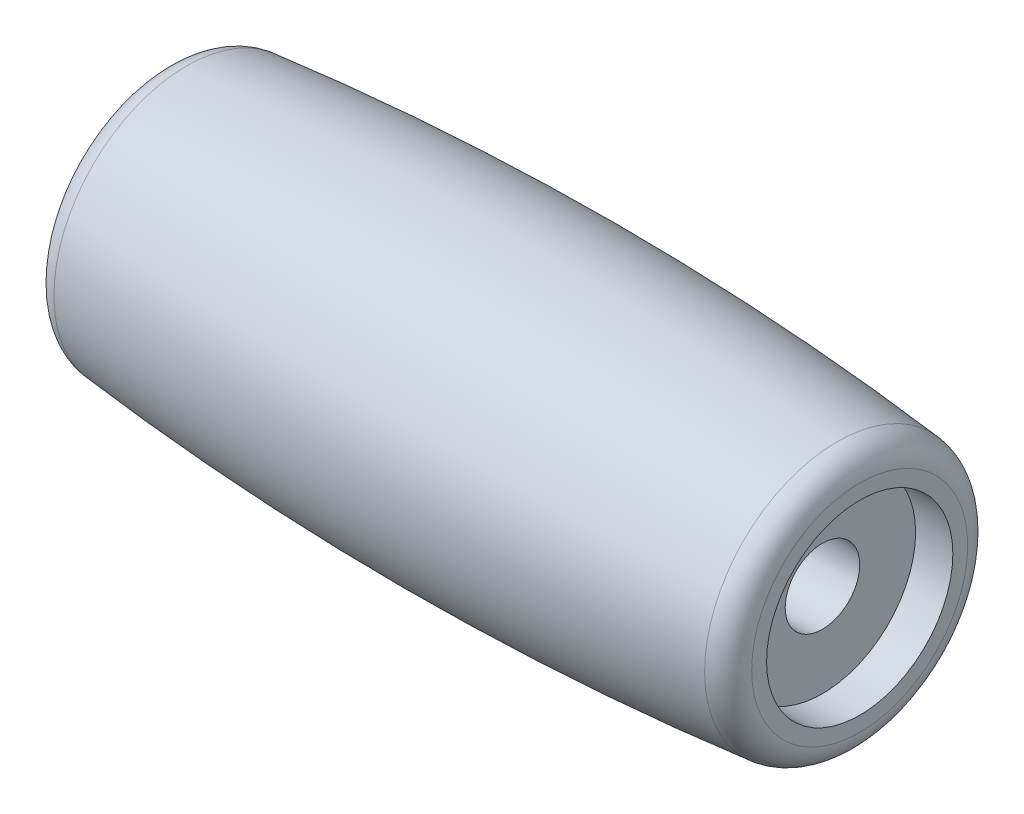
ISO-10303-21;
HEADER;
FILE_DESCRIPTION(('STEP AP214'),'2;1');
FILE_NAME('part.step','',(''),(''),'','','');
FILE_SCHEMA(('AUTOMOTIVE_DESIGN { 1 0 10303 214 1 1 1 1 }'));
ENDSEC;
DATA;
#1=APPLICATION_CONTEXT('core data for automotive mechanical design processes');
#2=APPLICATION_PROTOCOL_DEFINITION('international standard','automotive_design',2000,#1);
#3=PRODUCT_CONTEXT('',#1,'mechanical');
#4=PRODUCT('Part','Part','',(#3));
#5=PRODUCT_RELATED_PRODUCT_CATEGORY('part','',(#4));
#6=PRODUCT_DEFINITION_FORMATION('','',#4);
#7=PRODUCT_DEFINITION_CONTEXT('part definition',#1,'design');
#8=PRODUCT_DEFINITION('design','',#6,#7);
#9=PRODUCT_DEFINITION_SHAPE('','',#8);
#10=(LENGTH_UNIT() NAMED_UNIT(*) SI_UNIT(.MILLI.,.METRE.));
#11=(NAMED_UNIT(*) PLANE_ANGLE_UNIT() SI_UNIT($,.RADIAN.));
#12=(NAMED_UNIT(*) SI_UNIT($,.STERADIAN.) SOLID_ANGLE_UNIT());
#13=UNCERTAINTY_MEASURE_WITH_UNIT(LENGTH_MEASURE(1.E-05),#10,'distance_accuracy_value','');
#14=(GEOMETRIC_REPRESENTATION_CONTEXT(3) GLOBAL_UNCERTAINTY_ASSIGNED_CONTEXT((#13)) GLOBAL_UNIT_ASSIGNED_CONTEXT((#10,
#11,#12)) REPRESENTATION_CONTEXT('',''));
#15=CARTESIAN_POINT('',(0.,0.,0.));
#16=DIRECTION('',(0.,0.,1.));
#17=DIRECTION('',(1.,0.,0.));
#18=AXIS2_PLACEMENT_3D('',#15,#16,#17);
#19=CARTESIAN_POINT('',(12.5,1.5,0.));
#20=DIRECTION('',(-1.,0.,0.));
#21=DIRECTION('',(0.,0.,1.));
#22=AXIS2_PLACEMENT_3D('',#19,#20,#21);
#23=PLANE('',#22);
#24=CARTESIAN_POINT('',(12.5,0.,0.));
#25=DIRECTION('',(-1.,0.,0.));
#26=DIRECTION('',(0.,0.,1.));
#27=AXIS2_PLACEMENT_3D('',#24,#25,#26);
#28=CIRCLE('',#27,3.75);
#29=CARTESIAN_POINT('',(12.5,0.,3.75));
#30=VERTEX_POINT('',#29);
#31=EDGE_CURVE('E10',#30,#30,#28,.T.);
#32=ORIENTED_EDGE('',*,*,#31,.F.);
#33=EDGE_LOOP('',(#32));
#34=FACE_BOUND('',#33,.T.);
#35=CARTESIAN_POINT('',(12.5,0.,0.));
#36=DIRECTION('',(-1.,0.,0.));
#37=DIRECTION('',(0.,0.,1.));
#38=AXIS2_PLACEMENT_3D('',#35,#36,#37);
#39=CIRCLE('',#38,1.5);
#40=CARTESIAN_POINT('',(12.5,0.,1.5));
#41=VERTEX_POINT('',#40);
#42=EDGE_CURVE('E68',#41,#41,#39,.T.);
#43=ORIENTED_EDGE('',*,*,#42,.T.);
#44=EDGE_LOOP('',(#43));
#45=FACE_BOUND('',#44,.T.);
#46=ADVANCED_FACE('F34',(#34,#45),#23,.F.);
#47=CARTESIAN_POINT('',(0.,0.,0.));
#48=DIRECTION('',(-1.,0.,0.));
#49=DIRECTION('',(0.,0.,1.));
#50=AXIS2_PLACEMENT_3D('',#47,#48,#49);
#51=CYLINDRICAL_SURFACE('',#50,3.75);
#52=CARTESIAN_POINT('',(14.,0.,0.));
#53=DIRECTION('',(-1.,0.,0.));
#54=DIRECTION('',(0.,0.,1.));
#55=AXIS2_PLACEMENT_3D('',#52,#53,#54);
#56=CIRCLE('',#55,3.75);
#57=CARTESIAN_POINT('',(14.,0.,3.75));
#58=VERTEX_POINT('',#57);
#59=EDGE_CURVE('E40',#58,#58,#56,.T.);
#60=ORIENTED_EDGE('',*,*,#59,.F.);
#61=EDGE_LOOP('',(#60));
#62=FACE_BOUND('',#61,.T.);
#63=ORIENTED_EDGE('',*,*,#31,.T.);
#64=EDGE_LOOP('',(#63));
#65=FACE_BOUND('',#64,.T.);
#66=ADVANCED_FACE('F117',(#62,#65),#51,.F.);
#67=CARTESIAN_POINT('',(14.,3.75,0.));
#68=DIRECTION('',(-1.,0.,0.));
#69=DIRECTION('',(0.,0.,1.));
#70=AXIS2_PLACEMENT_3D('',#67,#68,#69);
#71=PLANE('',#70);
#72=CARTESIAN_POINT('',(14.,0.,0.));
#73=DIRECTION('',(-1.,0.,0.));
#74=DIRECTION('',(0.,0.,1.));
#75=AXIS2_PLACEMENT_3D('',#72,#73,#74);
#76=CIRCLE('',#75,4.34857666506388);
#77=CARTESIAN_POINT('',(14.,0.,4.34857666506388));
#78=VERTEX_POINT('',#77);
#79=EDGE_CURVE('E44',#78,#78,#76,.T.);
#80=ORIENTED_EDGE('',*,*,#79,.F.);
#81=EDGE_LOOP('',(#80));
#82=FACE_BOUND('',#81,.T.);
#83=ORIENTED_EDGE('',*,*,#59,.T.);
#84=EDGE_LOOP('',(#83));
#85=FACE_BOUND('',#84,.T.);
#86=ADVANCED_FACE('F112',(#82,#85),#71,.F.);
#87=CARTESIAN_POINT('',(13.,0.,0.));
#88=DIRECTION('',(-1.,0.,0.));
#89=DIRECTION('',(0.,0.,1.));
#90=AXIS2_PLACEMENT_3D('',#87,#88,#89);
#91=TOROIDAL_SURFACE('',#90,4.34857666506388,1.00000000000001);
#92=CARTESIAN_POINT('',(13.0999679589875,0.,0.));
#93=DIRECTION('',(-1.,0.,0.));
#94=DIRECTION('',(0.,0.,1.));
#95=AXIS2_PLACEMENT_3D('',#92,#93,#94);
#96=CIRCLE('',#95,5.34356732189231);
#97=CARTESIAN_POINT('',(13.0999679589875,0.,5.34356732189231));
#98=VERTEX_POINT('',#97);
#99=EDGE_CURVE('E48',#98,#98,#96,.T.);
#100=ORIENTED_EDGE('',*,*,#99,.F.);
#101=EDGE_LOOP('',(#100));
#102=FACE_BOUND('',#101,.T.);
#103=ORIENTED_EDGE('',*,*,#79,.T.);
#104=EDGE_LOOP('',(#103));
#105=FACE_BOUND('',#104,.T.);
#106=ADVANCED_FACE('F106',(#102,#105),#91,.T.);
#107=CARTESIAN_POINT('',(0.,0.,0.));
#108=DIRECTION('',(-1.,0.,0.));
#109=DIRECTION('',(0.,0.,1.));
#110=AXIS2_PLACEMENT_3D('',#107,#108,#109);
#111=DEGENERATE_TOROIDAL_SURFACE('',#110,125.041666666666,131.041666666666,.F.);
#112=CARTESIAN_POINT('',(-13.0999679589875,0.,0.));
#113=DIRECTION('',(-1.,0.,0.));
#114=DIRECTION('',(0.,0.,1.));
#115=AXIS2_PLACEMENT_3D('',#112,#113,#114);
#116=CIRCLE('',#115,5.34356732189233);
#117=CARTESIAN_POINT('',(-13.0999679589875,0.,5.34356732189233));
#118=VERTEX_POINT('',#117);
#119=EDGE_CURVE('E53',#118,#118,#116,.T.);
#120=ORIENTED_EDGE('',*,*,#119,.F.);
#121=EDGE_LOOP('',(#120));
#122=FACE_BOUND('',#121,.T.);
#123=ORIENTED_EDGE('',*,*,#99,.T.);
#124=EDGE_LOOP('',(#123));
#125=FACE_BOUND('',#124,.T.);
#126=ADVANCED_FACE('F100',(#122,#125),#111,.F.);
#127=CARTESIAN_POINT('',(-13.,0.,0.));
#128=DIRECTION('',(-1.,0.,0.));
#129=DIRECTION('',(0.,0.,1.));
#130=AXIS2_PLACEMENT_3D('',#127,#128,#129);
#131=TOROIDAL_SURFACE('',#130,4.34857666506388,1.00000000000001);
#132=CARTESIAN_POINT('',(-14.,0.,0.));
#133=DIRECTION('',(-1.,0.,0.));
#134=DIRECTION('',(0.,0.,1.));
#135=AXIS2_PLACEMENT_3D('',#132,#133,#134);
#136=CIRCLE('',#135,4.34857666506388);
#137=CARTESIAN_POINT('',(-14.,0.,4.34857666506388));
#138=VERTEX_POINT('',#137);
#139=EDGE_CURVE('E56',#138,#138,#136,.T.);
#140=ORIENTED_EDGE('',*,*,#139,.F.);
#141=EDGE_LOOP('',(#140));
#142=FACE_BOUND('',#141,.T.);
#143=ORIENTED_EDGE('',*,*,#119,.T.);
#144=EDGE_LOOP('',(#143));
#145=FACE_BOUND('',#144,.T.);
#146=ADVANCED_FACE('F94',(#142,#145),#131,.T.);
#147=CARTESIAN_POINT('',(-14.,3.75,0.));
#148=DIRECTION('',(1.,0.,0.));
#149=DIRECTION('',(0.,0.,-1.));
#150=AXIS2_PLACEMENT_3D('',#147,#148,#149);
#151=PLANE('',#150);
#152=CARTESIAN_POINT('',(-14.,0.,0.));
#153=DIRECTION('',(-1.,0.,0.));
#154=DIRECTION('',(0.,0.,1.));
#155=AXIS2_PLACEMENT_3D('',#152,#153,#154);
#156=CIRCLE('',#155,3.75);
#157=CARTESIAN_POINT('',(-14.,0.,3.75));
#158=VERTEX_POINT('',#157);
#159=EDGE_CURVE('E59',#158,#158,#156,.T.);
#160=ORIENTED_EDGE('',*,*,#159,.F.);
#161=EDGE_LOOP('',(#160));
#162=FACE_BOUND('',#161,.T.);
#163=ORIENTED_EDGE('',*,*,#139,.T.);
#164=EDGE_LOOP('',(#163));
#165=FACE_BOUND('',#164,.T.);
#166=ADVANCED_FACE('F88',(#162,#165),#151,.F.);
#167=CARTESIAN_POINT('',(0.,0.,0.));
#168=DIRECTION('',(-1.,0.,0.));
#169=DIRECTION('',(0.,0.,1.));
#170=AXIS2_PLACEMENT_3D('',#167,#168,#169);
#171=CYLINDRICAL_SURFACE('',#170,3.75);
#172=CARTESIAN_POINT('',(-12.5,0.,0.));
#173=DIRECTION('',(-1.,0.,0.));
#174=DIRECTION('',(0.,0.,1.));
#175=AXIS2_PLACEMENT_3D('',#172,#173,#174);
#176=CIRCLE('',#175,3.75);
#177=CARTESIAN_POINT('',(-12.5,0.,3.75));
#178=VERTEX_POINT('',#177);
#179=EDGE_CURVE('E62',#178,#178,#176,.T.);
#180=ORIENTED_EDGE('',*,*,#179,.F.);
#181=EDGE_LOOP('',(#180));
#182=FACE_BOUND('',#181,.T.);
#183=ORIENTED_EDGE('',*,*,#159,.T.);
#184=EDGE_LOOP('',(#183));
#185=FACE_BOUND('',#184,.T.);
#186=ADVANCED_FACE('F82',(#182,#185),#171,.F.);
#187=CARTESIAN_POINT('',(-12.5,1.5,0.));
#188=DIRECTION('',(1.,0.,0.));
#189=DIRECTION('',(0.,0.,-1.));
#190=AXIS2_PLACEMENT_3D('',#187,#188,#189);
#191=PLANE('',#190);
#192=CARTESIAN_POINT('',(-12.5,0.,0.));
#193=DIRECTION('',(-1.,0.,0.));
#194=DIRECTION('',(0.,0.,1.));
#195=AXIS2_PLACEMENT_3D('',#192,#193,#194);
#196=CIRCLE('',#195,1.5);
#197=CARTESIAN_POINT('',(-12.5,0.,1.5));
#198=VERTEX_POINT('',#197);
#199=EDGE_CURVE('E65',#198,#198,#196,.T.);
#200=ORIENTED_EDGE('',*,*,#199,.F.);
#201=EDGE_LOOP('',(#200));
#202=FACE_BOUND('',#201,.T.);
#203=ORIENTED_EDGE('',*,*,#179,.T.);
#204=EDGE_LOOP('',(#203));
#205=FACE_BOUND('',#204,.T.);
#206=ADVANCED_FACE('F76',(#202,#205),#191,.F.);
#207=CARTESIAN_POINT('',(0.,0.,0.));
#208=DIRECTION('',(-1.,0.,0.));
#209=DIRECTION('',(0.,0.,1.));
#210=AXIS2_PLACEMENT_3D('',#207,#208,#209);
#211=CYLINDRICAL_SURFACE('',#210,1.5);
#212=ORIENTED_EDGE('',*,*,#42,.F.);
#213=EDGE_LOOP('',(#212));
#214=FACE_BOUND('',#213,.T.);
#215=ORIENTED_EDGE('',*,*,#199,.T.);
#216=EDGE_LOOP('',(#215));
#217=FACE_BOUND('',#216,.T.);
#218=ADVANCED_FACE('F73',(#214,#217),#211,.F.);
#219=CLOSED_SHELL('',(#46,#66,#86,#106,#126,#146,#166,#186,#206,#218));
#220=MANIFOLD_SOLID_BREP('B2',#219);
#221=ADVANCED_BREP_SHAPE_REPRESENTATION('',(#18,#220),#14);
#222=SHAPE_DEFINITION_REPRESENTATION(#9,#221);
ENDSEC;
END-ISO-10303-21;
